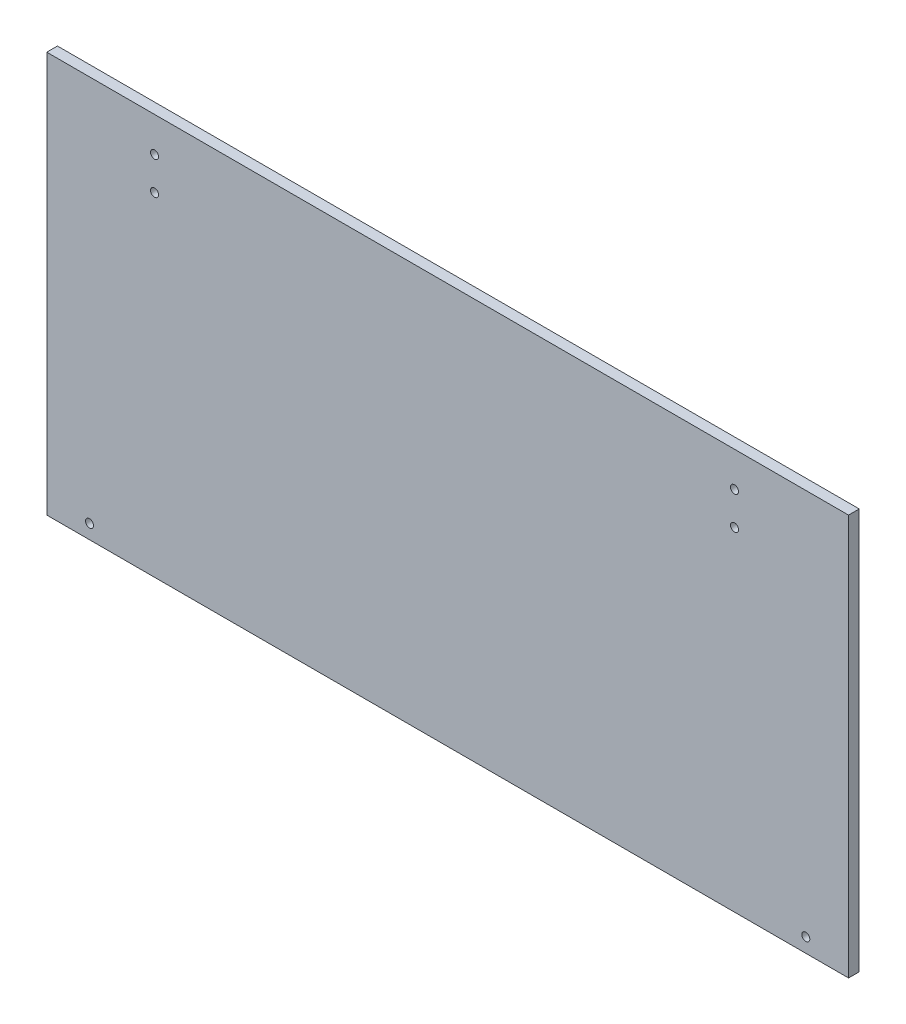
ISO-10303-21;
HEADER;
FILE_DESCRIPTION(('STEP AP214'),'2;1');
FILE_NAME('part.step','',(''),(''),'','','');
FILE_SCHEMA(('AUTOMOTIVE_DESIGN { 1 0 10303 214 1 1 1 1 }'));
ENDSEC;
DATA;
#1=APPLICATION_CONTEXT('core data for automotive mechanical design processes');
#2=APPLICATION_PROTOCOL_DEFINITION('international standard','automotive_design',2000,#1);
#3=PRODUCT_CONTEXT('',#1,'mechanical');
#4=PRODUCT('Part','Part','',(#3));
#5=PRODUCT_RELATED_PRODUCT_CATEGORY('part','',(#4));
#6=PRODUCT_DEFINITION_FORMATION('','',#4);
#7=PRODUCT_DEFINITION_CONTEXT('part definition',#1,'design');
#8=PRODUCT_DEFINITION('design','',#6,#7);
#9=PRODUCT_DEFINITION_SHAPE('','',#8);
#10=(LENGTH_UNIT() NAMED_UNIT(*) SI_UNIT(.MILLI.,.METRE.));
#11=(NAMED_UNIT(*) PLANE_ANGLE_UNIT() SI_UNIT($,.RADIAN.));
#12=(NAMED_UNIT(*) SI_UNIT($,.STERADIAN.) SOLID_ANGLE_UNIT());
#13=UNCERTAINTY_MEASURE_WITH_UNIT(LENGTH_MEASURE(1.E-05),#10,'distance_accuracy_value','');
#14=(GEOMETRIC_REPRESENTATION_CONTEXT(3) GLOBAL_UNCERTAINTY_ASSIGNED_CONTEXT((#13)) GLOBAL_UNIT_ASSIGNED_CONTEXT((#10,
#11,#12)) REPRESENTATION_CONTEXT('',''));
#15=CARTESIAN_POINT('',(0.,0.,0.));
#16=DIRECTION('',(0.,0.,1.));
#17=DIRECTION('',(1.,0.,0.));
#18=AXIS2_PLACEMENT_3D('',#15,#16,#17);
#19=CARTESIAN_POINT('',(-225.,112.5,6.));
#20=DIRECTION('',(1.,0.,0.));
#21=DIRECTION('',(0.,1.,0.));
#22=AXIS2_PLACEMENT_3D('',#19,#20,#21);
#23=PLANE('',#22);
#24=DIRECTION('',(0.,-1.,0.));
#25=VECTOR('',#24,1.);
#26=CARTESIAN_POINT('',(-225.,112.5,0.));
#27=LINE('',#26,#25);
#28=CARTESIAN_POINT('',(-225.,112.5,0.));
#29=VERTEX_POINT('',#28);
#30=CARTESIAN_POINT('',(-225.,-112.5,0.));
#31=VERTEX_POINT('',#30);
#32=EDGE_CURVE('E100',#29,#31,#27,.T.);
#33=ORIENTED_EDGE('',*,*,#32,.T.);
#34=DIRECTION('',(0.,0.,-1.));
#35=VECTOR('',#34,1.);
#36=CARTESIAN_POINT('',(-225.,-112.5,6.));
#37=LINE('',#36,#35);
#38=CARTESIAN_POINT('',(-225.,-112.5,6.));
#39=VERTEX_POINT('',#38);
#40=EDGE_CURVE('E11',#39,#31,#37,.T.);
#41=ORIENTED_EDGE('',*,*,#40,.F.);
#42=DIRECTION('',(0.,-1.,0.));
#43=VECTOR('',#42,1.);
#44=CARTESIAN_POINT('',(-225.,112.5,6.));
#45=LINE('',#44,#43);
#46=CARTESIAN_POINT('',(-225.,112.5,6.));
#47=VERTEX_POINT('',#46);
#48=EDGE_CURVE('E88',#47,#39,#45,.T.);
#49=ORIENTED_EDGE('',*,*,#48,.F.);
#50=DIRECTION('',(0.,0.,-1.));
#51=VECTOR('',#50,1.);
#52=CARTESIAN_POINT('',(-225.,112.5,6.));
#53=LINE('',#52,#51);
#54=EDGE_CURVE('E96',#47,#29,#53,.T.);
#55=ORIENTED_EDGE('',*,*,#54,.T.);
#56=EDGE_LOOP('',(#33,#41,#49,#55));
#57=FACE_BOUND('',#56,.T.);
#58=ADVANCED_FACE('F37',(#57),#23,.F.);
#59=CARTESIAN_POINT('',(-225.,-112.5,6.));
#60=DIRECTION('',(0.,1.,0.));
#61=DIRECTION('',(0.,0.,1.));
#62=AXIS2_PLACEMENT_3D('',#59,#60,#61);
#63=PLANE('',#62);
#64=DIRECTION('',(1.,0.,0.));
#65=VECTOR('',#64,1.);
#66=CARTESIAN_POINT('',(-225.,-112.5,0.));
#67=LINE('',#66,#65);
#68=CARTESIAN_POINT('',(225.,-112.5,0.));
#69=VERTEX_POINT('',#68);
#70=EDGE_CURVE('E92',#31,#69,#67,.T.);
#71=ORIENTED_EDGE('',*,*,#70,.T.);
#72=DIRECTION('',(0.,0.,-1.));
#73=VECTOR('',#72,1.);
#74=CARTESIAN_POINT('',(225.,-112.5,6.));
#75=LINE('',#74,#73);
#76=CARTESIAN_POINT('',(225.,-112.5,6.));
#77=VERTEX_POINT('',#76);
#78=EDGE_CURVE('E45',#77,#69,#75,.T.);
#79=ORIENTED_EDGE('',*,*,#78,.F.);
#80=DIRECTION('',(1.,0.,0.));
#81=VECTOR('',#80,1.);
#82=CARTESIAN_POINT('',(-225.,-112.5,6.));
#83=LINE('',#82,#81);
#84=EDGE_CURVE('E83',#39,#77,#83,.T.);
#85=ORIENTED_EDGE('',*,*,#84,.F.);
#86=ORIENTED_EDGE('',*,*,#40,.T.);
#87=EDGE_LOOP('',(#71,#79,#85,#86));
#88=FACE_BOUND('',#87,.T.);
#89=ADVANCED_FACE('F91',(#88),#63,.F.);
#90=CARTESIAN_POINT('',(225.,112.5,6.));
#91=DIRECTION('',(-1.,0.,0.));
#92=DIRECTION('',(0.,-1.,0.));
#93=AXIS2_PLACEMENT_3D('',#90,#91,#92);
#94=PLANE('',#93);
#95=DIRECTION('',(0.,1.,0.));
#96=VECTOR('',#95,1.);
#97=CARTESIAN_POINT('',(225.,112.5,0.));
#98=LINE('',#97,#96);
#99=CARTESIAN_POINT('',(225.,112.5,0.));
#100=VERTEX_POINT('',#99);
#101=EDGE_CURVE('E70',#69,#100,#98,.T.);
#102=ORIENTED_EDGE('',*,*,#101,.T.);
#103=DIRECTION('',(0.,0.,-1.));
#104=VECTOR('',#103,1.);
#105=CARTESIAN_POINT('',(225.,112.5,6.));
#106=LINE('',#105,#104);
#107=CARTESIAN_POINT('',(225.,112.5,6.));
#108=VERTEX_POINT('',#107);
#109=EDGE_CURVE('E93',#108,#100,#106,.T.);
#110=ORIENTED_EDGE('',*,*,#109,.F.);
#111=DIRECTION('',(0.,1.,0.));
#112=VECTOR('',#111,1.);
#113=CARTESIAN_POINT('',(225.,112.5,6.));
#114=LINE('',#113,#112);
#115=EDGE_CURVE('E86',#77,#108,#114,.T.);
#116=ORIENTED_EDGE('',*,*,#115,.F.);
#117=ORIENTED_EDGE('',*,*,#78,.T.);
#118=EDGE_LOOP('',(#102,#110,#116,#117));
#119=FACE_BOUND('',#118,.T.);
#120=ADVANCED_FACE('F94',(#119),#94,.F.);
#121=CARTESIAN_POINT('',(-225.,112.5,6.));
#122=DIRECTION('',(0.,-1.,0.));
#123=DIRECTION('',(0.,0.,-1.));
#124=AXIS2_PLACEMENT_3D('',#121,#122,#123);
#125=PLANE('',#124);
#126=DIRECTION('',(-1.,0.,0.));
#127=VECTOR('',#126,1.);
#128=CARTESIAN_POINT('',(-225.,112.5,0.));
#129=LINE('',#128,#127);
#130=EDGE_CURVE('E76',#100,#29,#129,.T.);
#131=ORIENTED_EDGE('',*,*,#130,.T.);
#132=ORIENTED_EDGE('',*,*,#54,.F.);
#133=DIRECTION('',(-1.,0.,0.));
#134=VECTOR('',#133,1.);
#135=CARTESIAN_POINT('',(-225.,112.5,6.));
#136=LINE('',#135,#134);
#137=EDGE_CURVE('E53',#108,#47,#136,.T.);
#138=ORIENTED_EDGE('',*,*,#137,.F.);
#139=ORIENTED_EDGE('',*,*,#109,.T.);
#140=EDGE_LOOP('',(#131,#132,#138,#139));
#141=FACE_BOUND('',#140,.T.);
#142=ADVANCED_FACE('F108',(#141),#125,.F.);
#143=CARTESIAN_POINT('',(0.,0.,6.));
#144=DIRECTION('',(0.,0.,1.));
#145=DIRECTION('',(1.,0.,0.));
#146=AXIS2_PLACEMENT_3D('',#143,#144,#145);
#147=PLANE('',#146);
#148=CARTESIAN_POINT('',(-201.,-104.5,6.));
#149=DIRECTION('',(0.,0.,1.));
#150=DIRECTION('',(1.,0.,0.));
#151=AXIS2_PLACEMENT_3D('',#148,#149,#150);
#152=CIRCLE('',#151,2.25000000000001);
#153=CARTESIAN_POINT('',(-198.75,-104.5,6.));
#154=VERTEX_POINT('',#153);
#155=EDGE_CURVE('E137',#154,#154,#152,.T.);
#156=ORIENTED_EDGE('',*,*,#155,.F.);
#157=EDGE_LOOP('',(#156));
#158=FACE_BOUND('',#157,.T.);
#159=CARTESIAN_POINT('',(201.,-104.5,6.));
#160=DIRECTION('',(0.,0.,1.));
#161=DIRECTION('',(1.,0.,0.));
#162=AXIS2_PLACEMENT_3D('',#159,#160,#161);
#163=CIRCLE('',#162,2.25000000000001);
#164=CARTESIAN_POINT('',(203.25,-104.5,6.));
#165=VERTEX_POINT('',#164);
#166=EDGE_CURVE('E140',#165,#165,#163,.T.);
#167=ORIENTED_EDGE('',*,*,#166,.F.);
#168=EDGE_LOOP('',(#167));
#169=FACE_BOUND('',#168,.T.);
#170=CARTESIAN_POINT('',(161.,74.5,6.));
#171=DIRECTION('',(0.,0.,1.));
#172=DIRECTION('',(1.,0.,0.));
#173=AXIS2_PLACEMENT_3D('',#170,#171,#172);
#174=CIRCLE('',#173,2.25000000000001);
#175=CARTESIAN_POINT('',(163.25,74.5,6.));
#176=VERTEX_POINT('',#175);
#177=EDGE_CURVE('E103',#176,#176,#174,.T.);
#178=ORIENTED_EDGE('',*,*,#177,.F.);
#179=EDGE_LOOP('',(#178));
#180=FACE_BOUND('',#179,.T.);
#181=CARTESIAN_POINT('',(-164.5,92.9999999999999,6.));
#182=DIRECTION('',(0.,0.,1.));
#183=DIRECTION('',(1.,0.,0.));
#184=AXIS2_PLACEMENT_3D('',#181,#182,#183);
#185=CIRCLE('',#184,2.25000000000001);
#186=CARTESIAN_POINT('',(-162.25,92.9999999999999,6.));
#187=VERTEX_POINT('',#186);
#188=EDGE_CURVE('E116',#187,#187,#185,.T.);
#189=ORIENTED_EDGE('',*,*,#188,.F.);
#190=EDGE_LOOP('',(#189));
#191=FACE_BOUND('',#190,.T.);
#192=CARTESIAN_POINT('',(-164.5,74.4999999999999,6.));
#193=DIRECTION('',(0.,0.,1.));
#194=DIRECTION('',(1.,0.,0.));
#195=AXIS2_PLACEMENT_3D('',#192,#193,#194);
#196=CIRCLE('',#195,2.25000000000001);
#197=CARTESIAN_POINT('',(-162.25,74.4999999999999,6.));
#198=VERTEX_POINT('',#197);
#199=EDGE_CURVE('E119',#198,#198,#196,.T.);
#200=ORIENTED_EDGE('',*,*,#199,.F.);
#201=EDGE_LOOP('',(#200));
#202=FACE_BOUND('',#201,.T.);
#203=CARTESIAN_POINT('',(161.,93.,6.));
#204=DIRECTION('',(0.,0.,1.));
#205=DIRECTION('',(1.,0.,0.));
#206=AXIS2_PLACEMENT_3D('',#203,#204,#205);
#207=CIRCLE('',#206,2.25000000000001);
#208=CARTESIAN_POINT('',(163.25,93.,6.));
#209=VERTEX_POINT('',#208);
#210=EDGE_CURVE('E122',#209,#209,#207,.T.);
#211=ORIENTED_EDGE('',*,*,#210,.F.);
#212=EDGE_LOOP('',(#211));
#213=FACE_BOUND('',#212,.T.);
#214=ORIENTED_EDGE('',*,*,#48,.T.);
#215=ORIENTED_EDGE('',*,*,#84,.T.);
#216=ORIENTED_EDGE('',*,*,#115,.T.);
#217=ORIENTED_EDGE('',*,*,#137,.T.);
#218=EDGE_LOOP('',(#214,#215,#216,#217));
#219=FACE_BOUND('',#218,.T.);
#220=ADVANCED_FACE('F84',(#158,#169,#180,#191,#202,#213,#219),#147,.T.);
#221=CARTESIAN_POINT('',(0.,0.,0.));
#222=DIRECTION('',(0.,0.,1.));
#223=DIRECTION('',(1.,0.,0.));
#224=AXIS2_PLACEMENT_3D('',#221,#222,#223);
#225=PLANE('',#224);
#226=CARTESIAN_POINT('',(-201.,-104.5,0.));
#227=DIRECTION('',(0.,0.,-1.));
#228=DIRECTION('',(-1.,0.,0.));
#229=AXIS2_PLACEMENT_3D('',#226,#227,#228);
#230=CIRCLE('',#229,2.25000000000001);
#231=CARTESIAN_POINT('',(-203.25,-104.5,0.));
#232=VERTEX_POINT('',#231);
#233=EDGE_CURVE('E143',#232,#232,#230,.T.);
#234=ORIENTED_EDGE('',*,*,#233,.F.);
#235=EDGE_LOOP('',(#234));
#236=FACE_BOUND('',#235,.T.);
#237=CARTESIAN_POINT('',(201.,-104.5,0.));
#238=DIRECTION('',(0.,0.,-1.));
#239=DIRECTION('',(-1.,0.,0.));
#240=AXIS2_PLACEMENT_3D('',#237,#238,#239);
#241=CIRCLE('',#240,2.25000000000001);
#242=CARTESIAN_POINT('',(198.75,-104.5,0.));
#243=VERTEX_POINT('',#242);
#244=EDGE_CURVE('E144',#243,#243,#241,.T.);
#245=ORIENTED_EDGE('',*,*,#244,.F.);
#246=EDGE_LOOP('',(#245));
#247=FACE_BOUND('',#246,.T.);
#248=CARTESIAN_POINT('',(161.,74.5,0.));
#249=DIRECTION('',(0.,0.,-1.));
#250=DIRECTION('',(-1.,0.,0.));
#251=AXIS2_PLACEMENT_3D('',#248,#249,#250);
#252=CIRCLE('',#251,2.25000000000001);
#253=CARTESIAN_POINT('',(158.75,74.5,0.));
#254=VERTEX_POINT('',#253);
#255=EDGE_CURVE('E128',#254,#254,#252,.T.);
#256=ORIENTED_EDGE('',*,*,#255,.F.);
#257=EDGE_LOOP('',(#256));
#258=FACE_BOUND('',#257,.T.);
#259=CARTESIAN_POINT('',(-164.5,92.9999999999999,0.));
#260=DIRECTION('',(0.,0.,-1.));
#261=DIRECTION('',(-1.,0.,0.));
#262=AXIS2_PLACEMENT_3D('',#259,#260,#261);
#263=CIRCLE('',#262,2.25000000000001);
#264=CARTESIAN_POINT('',(-166.75,92.9999999999999,0.));
#265=VERTEX_POINT('',#264);
#266=EDGE_CURVE('E129',#265,#265,#263,.T.);
#267=ORIENTED_EDGE('',*,*,#266,.F.);
#268=EDGE_LOOP('',(#267));
#269=FACE_BOUND('',#268,.T.);
#270=CARTESIAN_POINT('',(-164.5,74.4999999999999,0.));
#271=DIRECTION('',(0.,0.,-1.));
#272=DIRECTION('',(-1.,0.,0.));
#273=AXIS2_PLACEMENT_3D('',#270,#271,#272);
#274=CIRCLE('',#273,2.25000000000001);
#275=CARTESIAN_POINT('',(-166.75,74.4999999999999,0.));
#276=VERTEX_POINT('',#275);
#277=EDGE_CURVE('E132',#276,#276,#274,.T.);
#278=ORIENTED_EDGE('',*,*,#277,.F.);
#279=EDGE_LOOP('',(#278));
#280=FACE_BOUND('',#279,.T.);
#281=CARTESIAN_POINT('',(161.,93.,0.));
#282=DIRECTION('',(0.,0.,-1.));
#283=DIRECTION('',(-1.,0.,0.));
#284=AXIS2_PLACEMENT_3D('',#281,#282,#283);
#285=CIRCLE('',#284,2.25000000000001);
#286=CARTESIAN_POINT('',(158.75,93.,0.));
#287=VERTEX_POINT('',#286);
#288=EDGE_CURVE('E125',#287,#287,#285,.T.);
#289=ORIENTED_EDGE('',*,*,#288,.F.);
#290=EDGE_LOOP('',(#289));
#291=FACE_BOUND('',#290,.T.);
#292=ORIENTED_EDGE('',*,*,#32,.F.);
#293=ORIENTED_EDGE('',*,*,#130,.F.);
#294=ORIENTED_EDGE('',*,*,#101,.F.);
#295=ORIENTED_EDGE('',*,*,#70,.F.);
#296=EDGE_LOOP('',(#292,#293,#294,#295));
#297=FACE_BOUND('',#296,.T.);
#298=ADVANCED_FACE('F111',(#236,#247,#258,#269,#280,#291,#297),#225,.F.);
#299=CARTESIAN_POINT('',(161.,93.,10.));
#300=DIRECTION('',(0.,0.,-1.));
#301=DIRECTION('',(-1.,0.,0.));
#302=AXIS2_PLACEMENT_3D('',#299,#300,#301);
#303=CYLINDRICAL_SURFACE('',#302,2.25000000000001);
#304=ORIENTED_EDGE('',*,*,#210,.T.);
#305=EDGE_LOOP('',(#304));
#306=FACE_BOUND('',#305,.T.);
#307=ORIENTED_EDGE('',*,*,#288,.T.);
#308=EDGE_LOOP('',(#307));
#309=FACE_BOUND('',#308,.T.);
#310=ADVANCED_FACE('F154',(#306,#309),#303,.F.);
#311=CARTESIAN_POINT('',(-164.5,74.4999999999999,10.));
#312=DIRECTION('',(0.,0.,-1.));
#313=DIRECTION('',(-1.,0.,0.));
#314=AXIS2_PLACEMENT_3D('',#311,#312,#313);
#315=CYLINDRICAL_SURFACE('',#314,2.25000000000001);
#316=ORIENTED_EDGE('',*,*,#199,.T.);
#317=EDGE_LOOP('',(#316));
#318=FACE_BOUND('',#317,.T.);
#319=ORIENTED_EDGE('',*,*,#277,.T.);
#320=EDGE_LOOP('',(#319));
#321=FACE_BOUND('',#320,.T.);
#322=ADVANCED_FACE('F167',(#318,#321),#315,.F.);
#323=CARTESIAN_POINT('',(-164.5,92.9999999999999,10.));
#324=DIRECTION('',(0.,0.,-1.));
#325=DIRECTION('',(-1.,0.,0.));
#326=AXIS2_PLACEMENT_3D('',#323,#324,#325);
#327=CYLINDRICAL_SURFACE('',#326,2.25000000000001);
#328=ORIENTED_EDGE('',*,*,#188,.T.);
#329=EDGE_LOOP('',(#328));
#330=FACE_BOUND('',#329,.T.);
#331=ORIENTED_EDGE('',*,*,#266,.T.);
#332=EDGE_LOOP('',(#331));
#333=FACE_BOUND('',#332,.T.);
#334=ADVANCED_FACE('F174',(#330,#333),#327,.F.);
#335=CARTESIAN_POINT('',(161.,74.5,10.));
#336=DIRECTION('',(0.,0.,-1.));
#337=DIRECTION('',(-1.,0.,0.));
#338=AXIS2_PLACEMENT_3D('',#335,#336,#337);
#339=CYLINDRICAL_SURFACE('',#338,2.25000000000001);
#340=ORIENTED_EDGE('',*,*,#177,.T.);
#341=EDGE_LOOP('',(#340));
#342=FACE_BOUND('',#341,.T.);
#343=ORIENTED_EDGE('',*,*,#255,.T.);
#344=EDGE_LOOP('',(#343));
#345=FACE_BOUND('',#344,.T.);
#346=ADVANCED_FACE('F209',(#342,#345),#339,.F.);
#347=CARTESIAN_POINT('',(201.,-104.5,10.));
#348=DIRECTION('',(0.,0.,-1.));
#349=DIRECTION('',(-1.,0.,0.));
#350=AXIS2_PLACEMENT_3D('',#347,#348,#349);
#351=CYLINDRICAL_SURFACE('',#350,2.25000000000001);
#352=ORIENTED_EDGE('',*,*,#166,.T.);
#353=EDGE_LOOP('',(#352));
#354=FACE_BOUND('',#353,.T.);
#355=ORIENTED_EDGE('',*,*,#244,.T.);
#356=EDGE_LOOP('',(#355));
#357=FACE_BOUND('',#356,.T.);
#358=ADVANCED_FACE('F213',(#354,#357),#351,.F.);
#359=CARTESIAN_POINT('',(-201.,-104.5,10.));
#360=DIRECTION('',(0.,0.,-1.));
#361=DIRECTION('',(-1.,0.,0.));
#362=AXIS2_PLACEMENT_3D('',#359,#360,#361);
#363=CYLINDRICAL_SURFACE('',#362,2.25000000000001);
#364=ORIENTED_EDGE('',*,*,#155,.T.);
#365=EDGE_LOOP('',(#364));
#366=FACE_BOUND('',#365,.T.);
#367=ORIENTED_EDGE('',*,*,#233,.T.);
#368=EDGE_LOOP('',(#367));
#369=FACE_BOUND('',#368,.T.);
#370=ADVANCED_FACE('F150',(#366,#369),#363,.F.);
#371=CLOSED_SHELL('',(#58,#89,#120,#142,#220,#298,#310,#322,#334,#346,#358,#370));
#372=MANIFOLD_SOLID_BREP('B2',#371);
#373=ADVANCED_BREP_SHAPE_REPRESENTATION('',(#18,#372),#14);
#374=SHAPE_DEFINITION_REPRESENTATION(#9,#373);
ENDSEC;
END-ISO-10303-21;
